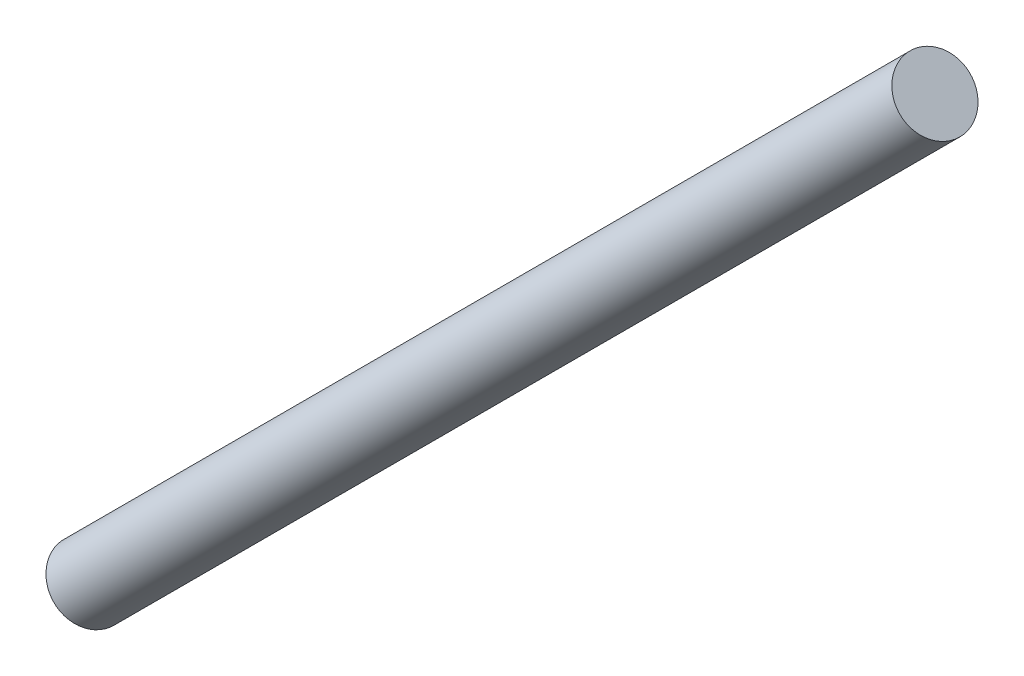
ISO-10303-21;
HEADER;
FILE_DESCRIPTION(('STEP AP214'),'2;1');
FILE_NAME('part.step','',(''),(''),'','','');
FILE_SCHEMA(('AUTOMOTIVE_DESIGN { 1 0 10303 214 1 1 1 1 }'));
ENDSEC;
DATA;
#1=APPLICATION_CONTEXT('core data for automotive mechanical design processes');
#2=APPLICATION_PROTOCOL_DEFINITION('international standard','automotive_design',2000,#1);
#3=PRODUCT_CONTEXT('',#1,'mechanical');
#4=PRODUCT('Part','Part','',(#3));
#5=PRODUCT_RELATED_PRODUCT_CATEGORY('part','',(#4));
#6=PRODUCT_DEFINITION_FORMATION('','',#4);
#7=PRODUCT_DEFINITION_CONTEXT('part definition',#1,'design');
#8=PRODUCT_DEFINITION('design','',#6,#7);
#9=PRODUCT_DEFINITION_SHAPE('','',#8);
#10=(LENGTH_UNIT() NAMED_UNIT(*) SI_UNIT(.MILLI.,.METRE.));
#11=(NAMED_UNIT(*) PLANE_ANGLE_UNIT() SI_UNIT($,.RADIAN.));
#12=(NAMED_UNIT(*) SI_UNIT($,.STERADIAN.) SOLID_ANGLE_UNIT());
#13=UNCERTAINTY_MEASURE_WITH_UNIT(LENGTH_MEASURE(1.E-05),#10,'distance_accuracy_value','');
#14=(GEOMETRIC_REPRESENTATION_CONTEXT(3) GLOBAL_UNCERTAINTY_ASSIGNED_CONTEXT((#13)) GLOBAL_UNIT_ASSIGNED_CONTEXT((#10,
#11,#12)) REPRESENTATION_CONTEXT('',''));
#15=CARTESIAN_POINT('',(0.,0.,0.));
#16=DIRECTION('',(0.,0.,1.));
#17=DIRECTION('',(1.,0.,0.));
#18=AXIS2_PLACEMENT_3D('',#15,#16,#17);
#19=CARTESIAN_POINT('',(1.84417173336933,-52.5418632261594,-9.99999999999968));
#20=DIRECTION('',(0.707106781186544,0.707106781186551,0.));
#21=DIRECTION('',(-0.707106781186551,0.707106781186544,0.));
#22=AXIS2_PLACEMENT_3D('',#19,#20,#21);
#23=CYLINDRICAL_SURFACE('',#22,5.);
#24=CARTESIAN_POINT('',(1.84417173336933,-52.5418632261594,-9.99999999999968));
#25=DIRECTION('',(-0.707106781186544,-0.707106781186551,0.));
#26=DIRECTION('',(0.707106781186551,-0.707106781186544,0.));
#27=AXIS2_PLACEMENT_3D('',#24,#25,#26);
#28=CIRCLE('',#27,5.);
#29=CARTESIAN_POINT('',(5.37970563930208,-56.0773971320922,-9.99999999999968));
#30=VERTEX_POINT('',#29);
#31=EDGE_CURVE('E10',#30,#30,#28,.T.);
#32=ORIENTED_EDGE('',*,*,#31,.F.);
#33=EDGE_LOOP('',(#32));
#34=FACE_BOUND('',#33,.T.);
#35=CARTESIAN_POINT('',(122.052324535082,67.6662895755543,-9.99999999999967));
#36=DIRECTION('',(-0.707106781186544,-0.707106781186551,0.));
#37=DIRECTION('',(0.707106781186551,-0.707106781186544,0.));
#38=AXIS2_PLACEMENT_3D('',#35,#36,#37);
#39=CIRCLE('',#38,5.);
#40=CARTESIAN_POINT('',(125.587858441015,64.1307556696215,-9.99999999999967));
#41=VERTEX_POINT('',#40);
#42=EDGE_CURVE('E31',#41,#41,#39,.T.);
#43=ORIENTED_EDGE('',*,*,#42,.T.);
#44=EDGE_LOOP('',(#43));
#45=FACE_BOUND('',#44,.T.);
#46=ADVANCED_FACE('F28',(#34,#45),#23,.T.);
#47=CARTESIAN_POINT('',(1.84417173336933,-52.5418632261594,-9.99999999999968));
#48=DIRECTION('',(-0.707106781186544,-0.707106781186551,0.));
#49=DIRECTION('',(0.707106781186551,-0.707106781186544,0.));
#50=AXIS2_PLACEMENT_3D('',#47,#48,#49);
#51=PLANE('',#50);
#52=ORIENTED_EDGE('',*,*,#31,.T.);
#53=EDGE_LOOP('',(#52));
#54=FACE_BOUND('',#53,.T.);
#55=ADVANCED_FACE('F43',(#54),#51,.T.);
#56=CARTESIAN_POINT('',(122.052324535082,67.6662895755543,-9.99999999999967));
#57=DIRECTION('',(-0.707106781186544,-0.707106781186551,0.));
#58=DIRECTION('',(0.707106781186551,-0.707106781186544,0.));
#59=AXIS2_PLACEMENT_3D('',#56,#57,#58);
#60=PLANE('',#59);
#61=ORIENTED_EDGE('',*,*,#42,.F.);
#62=EDGE_LOOP('',(#61));
#63=FACE_BOUND('',#62,.T.);
#64=ADVANCED_FACE('F41',(#63),#60,.F.);
#65=CLOSED_SHELL('',(#46,#55,#64));
#66=MANIFOLD_SOLID_BREP('B2',#65);
#67=ADVANCED_BREP_SHAPE_REPRESENTATION('',(#18,#66),#14);
#68=SHAPE_DEFINITION_REPRESENTATION(#9,#67);
ENDSEC;
END-ISO-10303-21;
